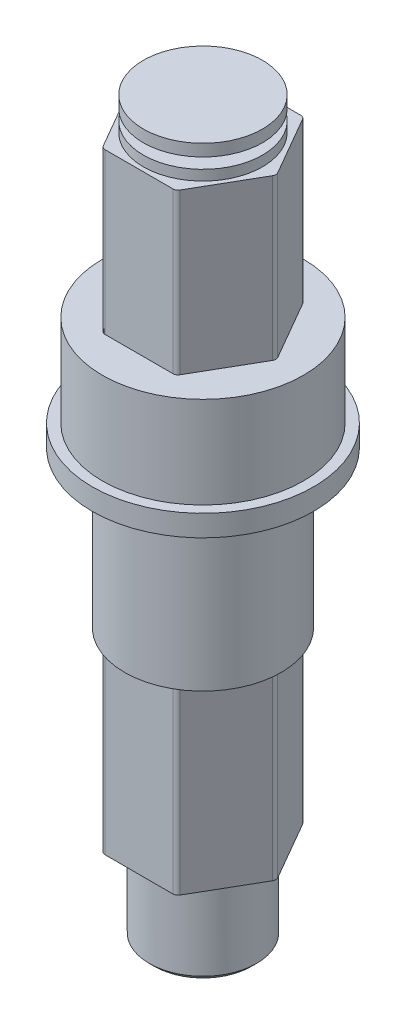
ISO-10303-21;
HEADER;
FILE_DESCRIPTION(('STEP AP214'),'2;1');
FILE_NAME('part.step','',(''),(''),'','','');
FILE_SCHEMA(('AUTOMOTIVE_DESIGN { 1 0 10303 214 1 1 1 1 }'));
ENDSEC;
DATA;
#1=APPLICATION_CONTEXT('core data for automotive mechanical design processes');
#2=APPLICATION_PROTOCOL_DEFINITION('international standard','automotive_design',2000,#1);
#3=PRODUCT_CONTEXT('',#1,'mechanical');
#4=PRODUCT('Part','Part','',(#3));
#5=PRODUCT_RELATED_PRODUCT_CATEGORY('part','',(#4));
#6=PRODUCT_DEFINITION_FORMATION('','',#4);
#7=PRODUCT_DEFINITION_CONTEXT('part definition',#1,'design');
#8=PRODUCT_DEFINITION('design','',#6,#7);
#9=PRODUCT_DEFINITION_SHAPE('','',#8);
#10=(LENGTH_UNIT() NAMED_UNIT(*) SI_UNIT(.MILLI.,.METRE.));
#11=(NAMED_UNIT(*) PLANE_ANGLE_UNIT() SI_UNIT($,.RADIAN.));
#12=(NAMED_UNIT(*) SI_UNIT($,.STERADIAN.) SOLID_ANGLE_UNIT());
#13=UNCERTAINTY_MEASURE_WITH_UNIT(LENGTH_MEASURE(1.E-05),#10,'distance_accuracy_value','');
#14=(GEOMETRIC_REPRESENTATION_CONTEXT(3) GLOBAL_UNCERTAINTY_ASSIGNED_CONTEXT((#13)) GLOBAL_UNIT_ASSIGNED_CONTEXT((#10,
#11,#12)) REPRESENTATION_CONTEXT('',''));
#15=CARTESIAN_POINT('',(0.,0.,0.));
#16=DIRECTION('',(0.,0.,1.));
#17=DIRECTION('',(1.,0.,0.));
#18=AXIS2_PLACEMENT_3D('',#15,#16,#17);
#19=CARTESIAN_POINT('',(2.7496306570156,52.705,4.7625));
#20=DIRECTION('',(-0.866025403784439,0.,-0.5));
#21=DIRECTION('',(-0.5,0.,0.866025403784439));
#22=AXIS2_PLACEMENT_3D('',#19,#20,#21);
#23=PLANE('',#22);
#24=DIRECTION('',(-0.5,0.,0.866025403784439));
#25=VECTOR('',#24,1.);
#26=CARTESIAN_POINT('',(3.1778443335599,40.64,4.02081215572938));
#27=LINE('',#26,#25);
#28=CARTESIAN_POINT('',(5.38927608775056,40.64,0.1905));
#29=VERTEX_POINT('',#28);
#30=CARTESIAN_POINT('',(2.85961588329622,40.64,4.572));
#31=VERTEX_POINT('',#30);
#32=EDGE_CURVE('E263',#29,#31,#27,.T.);
#33=ORIENTED_EDGE('',*,*,#32,.F.);
#34=DIRECTION('',(0.,1.,0.));
#35=VECTOR('',#34,1.);
#36=CARTESIAN_POINT('',(5.38927608775056,52.705,0.1905));
#37=LINE('',#36,#35);
#38=CARTESIAN_POINT('',(5.38927608775056,52.578,0.1905));
#39=VERTEX_POINT('',#38);
#40=EDGE_CURVE('E240',#29,#39,#37,.T.);
#41=ORIENTED_EDGE('',*,*,#40,.T.);
#42=DIRECTION('',(0.5,0.,-0.866025403784439));
#43=VECTOR('',#42,1.);
#44=CARTESIAN_POINT('',(2.7496306570156,52.578,4.7625));
#45=LINE('',#44,#43);
#46=CARTESIAN_POINT('',(2.85961588329622,52.578,4.572));
#47=VERTEX_POINT('',#46);
#48=EDGE_CURVE('E294',#47,#39,#45,.T.);
#49=ORIENTED_EDGE('',*,*,#48,.F.);
#50=DIRECTION('',(0.,1.,0.));
#51=VECTOR('',#50,1.);
#52=CARTESIAN_POINT('',(2.85961588329622,52.705,4.572));
#53=LINE('',#52,#51);
#54=EDGE_CURVE('E238',#47,#31,#53,.F.);
#55=ORIENTED_EDGE('',*,*,#54,.T.);
#56=EDGE_LOOP('',(#33,#41,#49,#55));
#57=FACE_BOUND('',#56,.T.);
#58=ADVANCED_FACE('F19',(#57),#23,.F.);
#59=CARTESIAN_POINT('',(-2.74963065701559,52.705,4.7625));
#60=DIRECTION('',(0.,0.,-1.));
#61=DIRECTION('',(-1.,0.,0.));
#62=AXIS2_PLACEMENT_3D('',#59,#60,#61);
#63=PLANE('',#62);
#64=DIRECTION('',(-1.,0.,0.));
#65=VECTOR('',#64,1.);
#66=CARTESIAN_POINT('',(-1.89320330392697,40.64,4.7625));
#67=LINE('',#66,#65);
#68=CARTESIAN_POINT('',(2.52966020445434,40.64,4.7625));
#69=VERTEX_POINT('',#68);
#70=CARTESIAN_POINT('',(-2.52966020445434,40.64,4.7625));
#71=VERTEX_POINT('',#70);
#72=EDGE_CURVE('E270',#69,#71,#67,.T.);
#73=ORIENTED_EDGE('',*,*,#72,.F.);
#74=DIRECTION('',(0.,1.,0.));
#75=VECTOR('',#74,1.);
#76=CARTESIAN_POINT('',(2.52966020445434,52.705,4.7625));
#77=LINE('',#76,#75);
#78=CARTESIAN_POINT('',(2.52966020445434,52.578,4.7625));
#79=VERTEX_POINT('',#78);
#80=EDGE_CURVE('E244',#69,#79,#77,.T.);
#81=ORIENTED_EDGE('',*,*,#80,.T.);
#82=DIRECTION('',(1.,0.,0.));
#83=VECTOR('',#82,1.);
#84=CARTESIAN_POINT('',(-2.74963065701559,52.578,4.7625));
#85=LINE('',#84,#83);
#86=CARTESIAN_POINT('',(-2.52966020445434,52.578,4.7625));
#87=VERTEX_POINT('',#86);
#88=EDGE_CURVE('E301',#87,#79,#85,.T.);
#89=ORIENTED_EDGE('',*,*,#88,.F.);
#90=DIRECTION('',(0.,1.,0.));
#91=VECTOR('',#90,1.);
#92=CARTESIAN_POINT('',(-2.52966020445434,52.705,4.7625));
#93=LINE('',#92,#91);
#94=EDGE_CURVE('E38',#87,#71,#93,.F.);
#95=ORIENTED_EDGE('',*,*,#94,.T.);
#96=EDGE_LOOP('',(#73,#81,#89,#95));
#97=FACE_BOUND('',#96,.T.);
#98=ADVANCED_FACE('F405',(#97),#63,.F.);
#99=CARTESIAN_POINT('',(-5.49926131403119,52.705,0.));
#100=DIRECTION('',(0.866025403784439,0.,-0.5));
#101=DIRECTION('',(-0.5,0.,-0.866025403784439));
#102=AXIS2_PLACEMENT_3D('',#99,#100,#101);
#103=PLANE('',#102);
#104=DIRECTION('',(0.5,0.,0.866025403784439));
#105=VECTOR('',#104,1.);
#106=CARTESIAN_POINT('',(-5.49926131403119,52.578,0.));
#107=LINE('',#106,#105);
#108=CARTESIAN_POINT('',(-5.38927608775056,52.578,0.1905));
#109=VERTEX_POINT('',#108);
#110=CARTESIAN_POINT('',(-2.85961588329622,52.578,4.572));
#111=VERTEX_POINT('',#110);
#112=EDGE_CURVE('E293',#109,#111,#107,.T.);
#113=ORIENTED_EDGE('',*,*,#112,.F.);
#114=DIRECTION('',(0.,1.,0.));
#115=VECTOR('',#114,1.);
#116=CARTESIAN_POINT('',(-5.38927608775056,52.705,0.1905));
#117=LINE('',#116,#115);
#118=CARTESIAN_POINT('',(-5.38927608775056,40.64,0.1905));
#119=VERTEX_POINT('',#118);
#120=EDGE_CURVE('E235',#109,#119,#117,.F.);
#121=ORIENTED_EDGE('',*,*,#120,.T.);
#122=DIRECTION('',(-0.5,0.,-0.866025403784439));
#123=VECTOR('',#122,1.);
#124=CARTESIAN_POINT('',(-5.07104763748687,40.64,0.74168784427061));
#125=LINE('',#124,#123);
#126=CARTESIAN_POINT('',(-2.85961588329622,40.64,4.572));
#127=VERTEX_POINT('',#126);
#128=EDGE_CURVE('E251',#127,#119,#125,.T.);
#129=ORIENTED_EDGE('',*,*,#128,.F.);
#130=DIRECTION('',(0.,1.,0.));
#131=VECTOR('',#130,1.);
#132=CARTESIAN_POINT('',(-2.85961588329622,52.705,4.572));
#133=LINE('',#132,#131);
#134=EDGE_CURVE('E232',#127,#111,#133,.T.);
#135=ORIENTED_EDGE('',*,*,#134,.T.);
#136=EDGE_LOOP('',(#113,#121,#129,#135));
#137=FACE_BOUND('',#136,.T.);
#138=ADVANCED_FACE('F412',(#137),#103,.F.);
#139=CARTESIAN_POINT('',(-2.74963065701559,52.705,-4.7625));
#140=DIRECTION('',(0.866025403784439,0.,0.5));
#141=DIRECTION('',(0.5,0.,-0.866025403784439));
#142=AXIS2_PLACEMENT_3D('',#139,#140,#141);
#143=PLANE('',#142);
#144=DIRECTION('',(-0.5,0.,0.866025403784439));
#145=VECTOR('',#144,1.);
#146=CARTESIAN_POINT('',(-2.74963065701559,52.578,-4.7625));
#147=LINE('',#146,#145);
#148=CARTESIAN_POINT('',(-2.85961588329622,52.578,-4.572));
#149=VERTEX_POINT('',#148);
#150=CARTESIAN_POINT('',(-5.38927608775056,52.578,-0.1905));
#151=VERTEX_POINT('',#150);
#152=EDGE_CURVE('E256',#149,#151,#147,.T.);
#153=ORIENTED_EDGE('',*,*,#152,.F.);
#154=DIRECTION('',(0.,1.,0.));
#155=VECTOR('',#154,1.);
#156=CARTESIAN_POINT('',(-2.85961588329622,52.705,-4.572));
#157=LINE('',#156,#155);
#158=CARTESIAN_POINT('',(-2.85961588329622,40.64,-4.572));
#159=VERTEX_POINT('',#158);
#160=EDGE_CURVE('E230',#149,#159,#157,.F.);
#161=ORIENTED_EDGE('',*,*,#160,.T.);
#162=DIRECTION('',(0.5,0.,-0.866025403784439));
#163=VECTOR('',#162,1.);
#164=CARTESIAN_POINT('',(-3.1778443335599,40.64,-4.02081215572939));
#165=LINE('',#164,#163);
#166=CARTESIAN_POINT('',(-5.38927608775056,40.64,-0.1905));
#167=VERTEX_POINT('',#166);
#168=EDGE_CURVE('E259',#167,#159,#165,.T.);
#169=ORIENTED_EDGE('',*,*,#168,.F.);
#170=DIRECTION('',(0.,1.,0.));
#171=VECTOR('',#170,1.);
#172=CARTESIAN_POINT('',(-5.38927608775056,52.705,-0.1905));
#173=LINE('',#172,#171);
#174=EDGE_CURVE('E227',#167,#151,#173,.T.);
#175=ORIENTED_EDGE('',*,*,#174,.T.);
#176=EDGE_LOOP('',(#153,#161,#169,#175));
#177=FACE_BOUND('',#176,.T.);
#178=ADVANCED_FACE('F601',(#177),#143,.F.);
#179=CARTESIAN_POINT('',(2.74963065701559,52.705,-4.7625));
#180=DIRECTION('',(0.,0.,1.));
#181=DIRECTION('',(1.,0.,0.));
#182=AXIS2_PLACEMENT_3D('',#179,#180,#181);
#183=PLANE('',#182);
#184=DIRECTION('',(-1.,0.,0.));
#185=VECTOR('',#184,1.);
#186=CARTESIAN_POINT('',(2.74963065701559,52.578,-4.7625));
#187=LINE('',#186,#185);
#188=CARTESIAN_POINT('',(2.52966020445434,52.578,-4.7625));
#189=VERTEX_POINT('',#188);
#190=CARTESIAN_POINT('',(-2.52966020445434,52.578,-4.7625));
#191=VERTEX_POINT('',#190);
#192=EDGE_CURVE('E309',#189,#191,#187,.T.);
#193=ORIENTED_EDGE('',*,*,#192,.F.);
#194=DIRECTION('',(0.,1.,0.));
#195=VECTOR('',#194,1.);
#196=CARTESIAN_POINT('',(2.52966020445434,52.705,-4.7625));
#197=LINE('',#196,#195);
#198=CARTESIAN_POINT('',(2.52966020445434,40.64,-4.7625));
#199=VERTEX_POINT('',#198);
#200=EDGE_CURVE('E224',#189,#199,#197,.F.);
#201=ORIENTED_EDGE('',*,*,#200,.T.);
#202=DIRECTION('',(1.,0.,0.));
#203=VECTOR('',#202,1.);
#204=CARTESIAN_POINT('',(1.89320330392697,40.64,-4.7625));
#205=LINE('',#204,#203);
#206=CARTESIAN_POINT('',(-2.52966020445434,40.64,-4.7625));
#207=VERTEX_POINT('',#206);
#208=EDGE_CURVE('E279',#207,#199,#205,.T.);
#209=ORIENTED_EDGE('',*,*,#208,.F.);
#210=DIRECTION('',(0.,1.,0.));
#211=VECTOR('',#210,1.);
#212=CARTESIAN_POINT('',(-2.52966020445434,52.705,-4.7625));
#213=LINE('',#212,#211);
#214=EDGE_CURVE('E221',#207,#191,#213,.T.);
#215=ORIENTED_EDGE('',*,*,#214,.T.);
#216=EDGE_LOOP('',(#193,#201,#209,#215));
#217=FACE_BOUND('',#216,.T.);
#218=ADVANCED_FACE('F594',(#217),#183,.F.);
#219=CARTESIAN_POINT('',(5.49926131403119,52.705,0.));
#220=DIRECTION('',(-0.866025403784439,0.,0.5));
#221=DIRECTION('',(0.5,0.,0.866025403784439));
#222=AXIS2_PLACEMENT_3D('',#219,#220,#221);
#223=PLANE('',#222);
#224=DIRECTION('',(0.5,0.,0.866025403784439));
#225=VECTOR('',#224,1.);
#226=CARTESIAN_POINT('',(5.07104763748687,40.64,-0.741687844270615));
#227=LINE('',#226,#225);
#228=CARTESIAN_POINT('',(2.85961588329622,40.64,-4.572));
#229=VERTEX_POINT('',#228);
#230=CARTESIAN_POINT('',(5.38927608775056,40.64,-0.1905));
#231=VERTEX_POINT('',#230);
#232=EDGE_CURVE('E262',#229,#231,#227,.T.);
#233=ORIENTED_EDGE('',*,*,#232,.F.);
#234=DIRECTION('',(0.,1.,0.));
#235=VECTOR('',#234,1.);
#236=CARTESIAN_POINT('',(2.85961588329622,52.705,-4.572));
#237=LINE('',#236,#235);
#238=CARTESIAN_POINT('',(2.85961588329622,52.578,-4.572));
#239=VERTEX_POINT('',#238);
#240=EDGE_CURVE('E216',#229,#239,#237,.T.);
#241=ORIENTED_EDGE('',*,*,#240,.T.);
#242=DIRECTION('',(-0.5,0.,-0.866025403784439));
#243=VECTOR('',#242,1.);
#244=CARTESIAN_POINT('',(5.49926131403119,52.578,0.));
#245=LINE('',#244,#243);
#246=CARTESIAN_POINT('',(5.38927608775056,52.578,-0.1905));
#247=VERTEX_POINT('',#246);
#248=EDGE_CURVE('E290',#247,#239,#245,.T.);
#249=ORIENTED_EDGE('',*,*,#248,.F.);
#250=DIRECTION('',(0.,1.,0.));
#251=VECTOR('',#250,1.);
#252=CARTESIAN_POINT('',(5.38927608775056,52.705,-0.1905));
#253=LINE('',#252,#251);
#254=EDGE_CURVE('E214',#247,#231,#253,.F.);
#255=ORIENTED_EDGE('',*,*,#254,.T.);
#256=EDGE_LOOP('',(#233,#241,#249,#255));
#257=FACE_BOUND('',#256,.T.);
#258=ADVANCED_FACE('F430',(#257),#223,.F.);
#259=CARTESIAN_POINT('',(0.,40.64,0.));
#260=DIRECTION('',(0.,1.,0.));
#261=DIRECTION('',(0.,0.,1.));
#262=AXIS2_PLACEMENT_3D('',#259,#260,#261);
#263=PLANE('',#262);
#264=ORIENTED_EDGE('',*,*,#168,.T.);
#265=CARTESIAN_POINT('',(-2.52966020445434,40.64,-4.3815));
#266=DIRECTION('',(0.,1.,0.));
#267=DIRECTION('',(0.,0.,1.));
#268=AXIS2_PLACEMENT_3D('',#265,#266,#267);
#269=CIRCLE('',#268,0.381);
#270=EDGE_CURVE('E268',#159,#207,#269,.F.);
#271=ORIENTED_EDGE('',*,*,#270,.T.);
#272=ORIENTED_EDGE('',*,*,#208,.T.);
#273=CARTESIAN_POINT('',(2.52966020445434,40.64,-4.3815));
#274=DIRECTION('',(0.,1.,0.));
#275=DIRECTION('',(0.,0.,1.));
#276=AXIS2_PLACEMENT_3D('',#273,#274,#275);
#277=CIRCLE('',#276,0.381);
#278=EDGE_CURVE('E247',#199,#229,#277,.F.);
#279=ORIENTED_EDGE('',*,*,#278,.T.);
#280=ORIENTED_EDGE('',*,*,#232,.T.);
#281=CARTESIAN_POINT('',(5.05932040890869,40.64,0.));
#282=DIRECTION('',(0.,1.,0.));
#283=DIRECTION('',(0.,0.,1.));
#284=AXIS2_PLACEMENT_3D('',#281,#282,#283);
#285=CIRCLE('',#284,0.381);
#286=EDGE_CURVE('E267',#231,#29,#285,.F.);
#287=ORIENTED_EDGE('',*,*,#286,.T.);
#288=ORIENTED_EDGE('',*,*,#32,.T.);
#289=CARTESIAN_POINT('',(2.52966020445434,40.64,4.3815));
#290=DIRECTION('',(0.,1.,0.));
#291=DIRECTION('',(0.,0.,1.));
#292=AXIS2_PLACEMENT_3D('',#289,#290,#291);
#293=CIRCLE('',#292,0.381);
#294=EDGE_CURVE('E29',#31,#69,#293,.F.);
#295=ORIENTED_EDGE('',*,*,#294,.T.);
#296=ORIENTED_EDGE('',*,*,#72,.T.);
#297=CARTESIAN_POINT('',(-2.52966020445434,40.64,4.3815));
#298=DIRECTION('',(0.,1.,0.));
#299=DIRECTION('',(0.,0.,1.));
#300=AXIS2_PLACEMENT_3D('',#297,#298,#299);
#301=CIRCLE('',#300,0.381);
#302=EDGE_CURVE('E12',#71,#127,#301,.F.);
#303=ORIENTED_EDGE('',*,*,#302,.T.);
#304=ORIENTED_EDGE('',*,*,#128,.T.);
#305=CARTESIAN_POINT('',(-5.05932040890869,40.64,0.));
#306=DIRECTION('',(0.,1.,0.));
#307=DIRECTION('',(0.,0.,1.));
#308=AXIS2_PLACEMENT_3D('',#305,#306,#307);
#309=CIRCLE('',#308,0.381);
#310=EDGE_CURVE('E264',#119,#167,#309,.F.);
#311=ORIENTED_EDGE('',*,*,#310,.T.);
#312=EDGE_LOOP('',(#264,#271,#272,#279,#280,#287,#288,#295,#296,#303,#304,#311));
#313=FACE_BOUND('',#312,.T.);
#314=CARTESIAN_POINT('',(0.,40.64,0.));
#315=DIRECTION('',(0.,1.,0.));
#316=DIRECTION('',(0.,0.,1.));
#317=AXIS2_PLACEMENT_3D('',#314,#315,#316);
#318=CIRCLE('',#317,7.499999986);
#319=CARTESIAN_POINT('',(0.,40.64,7.499999986));
#320=VERTEX_POINT('',#319);
#321=EDGE_CURVE('E285',#320,#320,#318,.T.);
#322=ORIENTED_EDGE('',*,*,#321,.T.);
#323=EDGE_LOOP('',(#322));
#324=FACE_BOUND('',#323,.T.);
#325=ADVANCED_FACE('F485',(#313,#324),#263,.T.);
#326=CARTESIAN_POINT('',(0.,17.3470920246051,0.));
#327=DIRECTION('',(0.,1.,0.));
#328=DIRECTION('',(0.,0.,1.));
#329=AXIS2_PLACEMENT_3D('',#326,#327,#328);
#330=CYLINDRICAL_SURFACE('',#329,4.445);
#331=CARTESIAN_POINT('',(0.,52.578,0.));
#332=DIRECTION('',(0.,1.,0.));
#333=DIRECTION('',(0.,0.,1.));
#334=AXIS2_PLACEMENT_3D('',#331,#332,#333);
#335=CIRCLE('',#334,4.445);
#336=CARTESIAN_POINT('',(0.,52.578,4.445));
#337=VERTEX_POINT('',#336);
#338=EDGE_CURVE('E305',#337,#337,#335,.F.);
#339=ORIENTED_EDGE('',*,*,#338,.F.);
#340=EDGE_LOOP('',(#339));
#341=FACE_BOUND('',#340,.T.);
#342=CARTESIAN_POINT('',(0.,53.34,0.));
#343=DIRECTION('',(0.,1.,0.));
#344=DIRECTION('',(0.,0.,1.));
#345=AXIS2_PLACEMENT_3D('',#342,#343,#344);
#346=CIRCLE('',#345,4.445);
#347=CARTESIAN_POINT('',(0.,53.34,4.445));
#348=VERTEX_POINT('',#347);
#349=EDGE_CURVE('E320',#348,#348,#346,.T.);
#350=ORIENTED_EDGE('',*,*,#349,.F.);
#351=EDGE_LOOP('',(#350));
#352=FACE_BOUND('',#351,.T.);
#353=ADVANCED_FACE('F483',(#341,#352),#330,.T.);
#354=CARTESIAN_POINT('',(0.,52.578,0.));
#355=DIRECTION('',(0.,1.,0.));
#356=DIRECTION('',(0.,0.,1.));
#357=AXIS2_PLACEMENT_3D('',#354,#355,#356);
#358=PLANE('',#357);
#359=ORIENTED_EDGE('',*,*,#248,.T.);
#360=CARTESIAN_POINT('',(2.52966020445434,52.578,-4.3815));
#361=DIRECTION('',(0.,1.,0.));
#362=DIRECTION('',(0.,0.,1.));
#363=AXIS2_PLACEMENT_3D('',#360,#361,#362);
#364=CIRCLE('',#363,0.381);
#365=EDGE_CURVE('E225',#239,#189,#364,.T.);
#366=ORIENTED_EDGE('',*,*,#365,.T.);
#367=ORIENTED_EDGE('',*,*,#192,.T.);
#368=CARTESIAN_POINT('',(-2.52966020445434,52.578,-4.3815));
#369=DIRECTION('',(0.,1.,0.));
#370=DIRECTION('',(0.,0.,1.));
#371=AXIS2_PLACEMENT_3D('',#368,#369,#370);
#372=CIRCLE('',#371,0.381);
#373=EDGE_CURVE('E311',#191,#149,#372,.T.);
#374=ORIENTED_EDGE('',*,*,#373,.T.);
#375=ORIENTED_EDGE('',*,*,#152,.T.);
#376=CARTESIAN_POINT('',(-5.05932040890869,52.578,0.));
#377=DIRECTION('',(0.,1.,0.));
#378=DIRECTION('',(0.,0.,1.));
#379=AXIS2_PLACEMENT_3D('',#376,#377,#378);
#380=CIRCLE('',#379,0.381);
#381=EDGE_CURVE('E297',#151,#109,#380,.T.);
#382=ORIENTED_EDGE('',*,*,#381,.T.);
#383=ORIENTED_EDGE('',*,*,#112,.T.);
#384=CARTESIAN_POINT('',(-2.52966020445434,52.578,4.3815));
#385=DIRECTION('',(0.,1.,0.));
#386=DIRECTION('',(0.,0.,1.));
#387=AXIS2_PLACEMENT_3D('',#384,#385,#386);
#388=CIRCLE('',#387,0.381);
#389=EDGE_CURVE('E220',#111,#87,#388,.T.);
#390=ORIENTED_EDGE('',*,*,#389,.T.);
#391=ORIENTED_EDGE('',*,*,#88,.T.);
#392=CARTESIAN_POINT('',(2.52966020445434,52.578,4.3815));
#393=DIRECTION('',(0.,1.,0.));
#394=DIRECTION('',(0.,0.,1.));
#395=AXIS2_PLACEMENT_3D('',#392,#393,#394);
#396=CIRCLE('',#395,0.381);
#397=EDGE_CURVE('E298',#79,#47,#396,.T.);
#398=ORIENTED_EDGE('',*,*,#397,.T.);
#399=ORIENTED_EDGE('',*,*,#48,.T.);
#400=CARTESIAN_POINT('',(5.05932040890869,52.578,0.));
#401=DIRECTION('',(0.,1.,0.));
#402=DIRECTION('',(0.,0.,1.));
#403=AXIS2_PLACEMENT_3D('',#400,#401,#402);
#404=CIRCLE('',#403,0.381);
#405=EDGE_CURVE('E295',#39,#247,#404,.T.);
#406=ORIENTED_EDGE('',*,*,#405,.T.);
#407=EDGE_LOOP('',(#359,#366,#367,#374,#375,#382,#383,#390,#391,#398,#399,#406));
#408=FACE_BOUND('',#407,.T.);
#409=ORIENTED_EDGE('',*,*,#338,.T.);
#410=EDGE_LOOP('',(#409));
#411=FACE_BOUND('',#410,.T.);
#412=ADVANCED_FACE('F479',(#408,#411),#358,.T.);
#413=CARTESIAN_POINT('',(0.,55.02275,0.));
#414=DIRECTION('',(0.,1.,0.));
#415=DIRECTION('',(0.,0.,1.));
#416=AXIS2_PLACEMENT_3D('',#413,#414,#415);
#417=PLANE('',#416);
#418=CARTESIAN_POINT('',(0.,55.02275,0.));
#419=DIRECTION('',(0.,1.,0.));
#420=DIRECTION('',(0.,0.,1.));
#421=AXIS2_PLACEMENT_3D('',#418,#419,#420);
#422=CIRCLE('',#421,4.445);
#423=CARTESIAN_POINT('',(0.,55.02275,4.445));
#424=VERTEX_POINT('',#423);
#425=EDGE_CURVE('E252',#424,#424,#422,.T.);
#426=ORIENTED_EDGE('',*,*,#425,.T.);
#427=EDGE_LOOP('',(#426));
#428=FACE_BOUND('',#427,.T.);
#429=ADVANCED_FACE('F482',(#428),#417,.T.);
#430=CARTESIAN_POINT('',(0.,55.53075,0.));
#431=DIRECTION('',(0.,-1.,0.));
#432=DIRECTION('',(0.,0.,-1.));
#433=AXIS2_PLACEMENT_3D('',#430,#431,#432);
#434=CYLINDRICAL_SURFACE('',#433,4.445);
#435=ORIENTED_EDGE('',*,*,#425,.F.);
#436=EDGE_LOOP('',(#435));
#437=FACE_BOUND('',#436,.T.);
#438=CARTESIAN_POINT('',(0.,54.13375,0.));
#439=DIRECTION('',(0.,1.,0.));
#440=DIRECTION('',(0.,0.,1.));
#441=AXIS2_PLACEMENT_3D('',#438,#439,#440);
#442=CIRCLE('',#441,4.445);
#443=CARTESIAN_POINT('',(0.,54.13375,4.445));
#444=VERTEX_POINT('',#443);
#445=EDGE_CURVE('E253',#444,#444,#442,.T.);
#446=ORIENTED_EDGE('',*,*,#445,.T.);
#447=EDGE_LOOP('',(#446));
#448=FACE_BOUND('',#447,.T.);
#449=ADVANCED_FACE('F473',(#437,#448),#434,.T.);
#450=CARTESIAN_POINT('',(0.,54.13375,0.));
#451=DIRECTION('',(0.,1.,0.));
#452=DIRECTION('',(0.,0.,1.));
#453=AXIS2_PLACEMENT_3D('',#450,#451,#452);
#454=PLANE('',#453);
#455=CARTESIAN_POINT('',(0.,54.13375,0.));
#456=DIRECTION('',(0.,1.,0.));
#457=DIRECTION('',(0.,0.,1.));
#458=AXIS2_PLACEMENT_3D('',#455,#456,#457);
#459=CIRCLE('',#458,3.175);
#460=CARTESIAN_POINT('',(0.,54.13375,3.175));
#461=VERTEX_POINT('',#460);
#462=EDGE_CURVE('E248',#461,#461,#459,.T.);
#463=ORIENTED_EDGE('',*,*,#462,.T.);
#464=EDGE_LOOP('',(#463));
#465=FACE_BOUND('',#464,.T.);
#466=ORIENTED_EDGE('',*,*,#445,.F.);
#467=EDGE_LOOP('',(#466));
#468=FACE_BOUND('',#467,.T.);
#469=ADVANCED_FACE('F469',(#465,#468),#454,.F.);
#470=CARTESIAN_POINT('',(0.,54.64175,0.));
#471=DIRECTION('',(0.,-1.,0.));
#472=DIRECTION('',(0.,0.,-1.));
#473=AXIS2_PLACEMENT_3D('',#470,#471,#472);
#474=CYLINDRICAL_SURFACE('',#473,3.175);
#475=ORIENTED_EDGE('',*,*,#462,.F.);
#476=EDGE_LOOP('',(#475));
#477=FACE_BOUND('',#476,.T.);
#478=CARTESIAN_POINT('',(0.,53.34,0.));
#479=DIRECTION('',(0.,1.,0.));
#480=DIRECTION('',(0.,0.,1.));
#481=AXIS2_PLACEMENT_3D('',#478,#479,#480);
#482=CIRCLE('',#481,3.175);
#483=CARTESIAN_POINT('',(0.,53.34,3.175));
#484=VERTEX_POINT('',#483);
#485=EDGE_CURVE('E217',#484,#484,#482,.T.);
#486=ORIENTED_EDGE('',*,*,#485,.T.);
#487=EDGE_LOOP('',(#486));
#488=FACE_BOUND('',#487,.T.);
#489=ADVANCED_FACE('F472',(#477,#488),#474,.T.);
#490=CARTESIAN_POINT('',(0.,53.34,0.));
#491=DIRECTION('',(0.,1.,0.));
#492=DIRECTION('',(0.,0.,1.));
#493=AXIS2_PLACEMENT_3D('',#490,#491,#492);
#494=PLANE('',#493);
#495=ORIENTED_EDGE('',*,*,#485,.F.);
#496=EDGE_LOOP('',(#495));
#497=FACE_BOUND('',#496,.T.);
#498=ORIENTED_EDGE('',*,*,#349,.T.);
#499=EDGE_LOOP('',(#498));
#500=FACE_BOUND('',#499,.T.);
#501=ADVANCED_FACE('F475',(#497,#500),#494,.T.);
#502=CARTESIAN_POINT('',(0.,62.3612033959985,0.));
#503=DIRECTION('',(0.,-1.,0.));
#504=DIRECTION('',(0.,0.,-1.));
#505=AXIS2_PLACEMENT_3D('',#502,#503,#504);
#506=CYLINDRICAL_SURFACE('',#505,7.499999986);
#507=CARTESIAN_POINT('',(0.,33.809760168,0.));
#508=DIRECTION('',(0.,1.,0.));
#509=DIRECTION('',(0.,0.,1.));
#510=AXIS2_PLACEMENT_3D('',#507,#508,#509);
#511=CIRCLE('',#510,7.499999986);
#512=CARTESIAN_POINT('',(0.,33.809760168,7.499999986));
#513=VERTEX_POINT('',#512);
#514=EDGE_CURVE('E331',#513,#513,#511,.T.);
#515=ORIENTED_EDGE('',*,*,#514,.T.);
#516=EDGE_LOOP('',(#515));
#517=FACE_BOUND('',#516,.T.);
#518=ORIENTED_EDGE('',*,*,#321,.F.);
#519=EDGE_LOOP('',(#518));
#520=FACE_BOUND('',#519,.T.);
#521=ADVANCED_FACE('F448',(#517,#520),#506,.T.);
#522=CARTESIAN_POINT('',(2.52966020445434,52.705,-4.3815));
#523=DIRECTION('',(0.,1.,0.));
#524=DIRECTION('',(0.,0.,1.));
#525=AXIS2_PLACEMENT_3D('',#522,#523,#524);
#526=CYLINDRICAL_SURFACE('',#525,0.381);
#527=ORIENTED_EDGE('',*,*,#278,.F.);
#528=ORIENTED_EDGE('',*,*,#200,.F.);
#529=ORIENTED_EDGE('',*,*,#365,.F.);
#530=ORIENTED_EDGE('',*,*,#240,.F.);
#531=EDGE_LOOP('',(#527,#528,#529,#530));
#532=FACE_BOUND('',#531,.T.);
#533=ADVANCED_FACE('F444',(#532),#526,.T.);
#534=CARTESIAN_POINT('',(-2.52966020445434,52.705,-4.3815));
#535=DIRECTION('',(0.,1.,0.));
#536=DIRECTION('',(0.,0.,1.));
#537=AXIS2_PLACEMENT_3D('',#534,#535,#536);
#538=CYLINDRICAL_SURFACE('',#537,0.381);
#539=ORIENTED_EDGE('',*,*,#270,.F.);
#540=ORIENTED_EDGE('',*,*,#160,.F.);
#541=ORIENTED_EDGE('',*,*,#373,.F.);
#542=ORIENTED_EDGE('',*,*,#214,.F.);
#543=EDGE_LOOP('',(#539,#540,#541,#542));
#544=FACE_BOUND('',#543,.T.);
#545=ADVANCED_FACE('F447',(#544),#538,.T.);
#546=CARTESIAN_POINT('',(-5.05932040890869,52.705,0.));
#547=DIRECTION('',(0.,1.,0.));
#548=DIRECTION('',(0.,0.,1.));
#549=AXIS2_PLACEMENT_3D('',#546,#547,#548);
#550=CYLINDRICAL_SURFACE('',#549,0.381);
#551=ORIENTED_EDGE('',*,*,#310,.F.);
#552=ORIENTED_EDGE('',*,*,#120,.F.);
#553=ORIENTED_EDGE('',*,*,#381,.F.);
#554=ORIENTED_EDGE('',*,*,#174,.F.);
#555=EDGE_LOOP('',(#551,#552,#553,#554));
#556=FACE_BOUND('',#555,.T.);
#557=ADVANCED_FACE('F452',(#556),#550,.T.);
#558=CARTESIAN_POINT('',(5.05932040890869,52.705,0.));
#559=DIRECTION('',(0.,1.,0.));
#560=DIRECTION('',(0.,0.,1.));
#561=AXIS2_PLACEMENT_3D('',#558,#559,#560);
#562=CYLINDRICAL_SURFACE('',#561,0.381);
#563=ORIENTED_EDGE('',*,*,#286,.F.);
#564=ORIENTED_EDGE('',*,*,#254,.F.);
#565=ORIENTED_EDGE('',*,*,#405,.F.);
#566=ORIENTED_EDGE('',*,*,#40,.F.);
#567=EDGE_LOOP('',(#563,#564,#565,#566));
#568=FACE_BOUND('',#567,.T.);
#569=ADVANCED_FACE('F456',(#568),#562,.T.);
#570=CARTESIAN_POINT('',(2.52966020445434,52.705,4.3815));
#571=DIRECTION('',(0.,1.,0.));
#572=DIRECTION('',(0.,0.,1.));
#573=AXIS2_PLACEMENT_3D('',#570,#571,#572);
#574=CYLINDRICAL_SURFACE('',#573,0.381);
#575=ORIENTED_EDGE('',*,*,#294,.F.);
#576=ORIENTED_EDGE('',*,*,#54,.F.);
#577=ORIENTED_EDGE('',*,*,#397,.F.);
#578=ORIENTED_EDGE('',*,*,#80,.F.);
#579=EDGE_LOOP('',(#575,#576,#577,#578));
#580=FACE_BOUND('',#579,.T.);
#581=ADVANCED_FACE('F460',(#580),#574,.T.);
#582=CARTESIAN_POINT('',(-2.52966020445434,52.705,4.3815));
#583=DIRECTION('',(0.,1.,0.));
#584=DIRECTION('',(0.,0.,1.));
#585=AXIS2_PLACEMENT_3D('',#582,#583,#584);
#586=CYLINDRICAL_SURFACE('',#585,0.381);
#587=ORIENTED_EDGE('',*,*,#302,.F.);
#588=ORIENTED_EDGE('',*,*,#94,.F.);
#589=ORIENTED_EDGE('',*,*,#389,.F.);
#590=ORIENTED_EDGE('',*,*,#134,.F.);
#591=EDGE_LOOP('',(#587,#588,#589,#590));
#592=FACE_BOUND('',#591,.T.);
#593=ADVANCED_FACE('F464',(#592),#586,.T.);
#594=CARTESIAN_POINT('',(0.,33.809760168,0.));
#595=DIRECTION('',(0.,1.,0.));
#596=DIRECTION('',(0.,0.,1.));
#597=AXIS2_PLACEMENT_3D('',#594,#595,#596);
#598=PLANE('',#597);
#599=CARTESIAN_POINT('',(0.,33.809760168,0.));
#600=DIRECTION('',(0.,1.,0.));
#601=DIRECTION('',(0.,0.,1.));
#602=AXIS2_PLACEMENT_3D('',#599,#600,#601);
#603=CIRCLE('',#602,8.255);
#604=CARTESIAN_POINT('',(0.,33.809760168,8.255));
#605=VERTEX_POINT('',#604);
#606=EDGE_CURVE('E289',#605,#605,#603,.T.);
#607=ORIENTED_EDGE('',*,*,#606,.T.);
#608=EDGE_LOOP('',(#607));
#609=FACE_BOUND('',#608,.T.);
#610=ORIENTED_EDGE('',*,*,#514,.F.);
#611=EDGE_LOOP('',(#610));
#612=FACE_BOUND('',#611,.T.);
#613=ADVANCED_FACE('F400',(#609,#612),#598,.T.);
#614=CARTESIAN_POINT('',(0.,33.809760168,0.));
#615=DIRECTION('',(0.,-1.,0.));
#616=DIRECTION('',(0.,0.,-1.));
#617=AXIS2_PLACEMENT_3D('',#614,#615,#616);
#618=CYLINDRICAL_SURFACE('',#617,8.255);
#619=ORIENTED_EDGE('',*,*,#606,.F.);
#620=EDGE_LOOP('',(#619));
#621=FACE_BOUND('',#620,.T.);
#622=CARTESIAN_POINT('',(0.,32.222260168,0.));
#623=DIRECTION('',(0.,1.,0.));
#624=DIRECTION('',(0.,0.,1.));
#625=AXIS2_PLACEMENT_3D('',#622,#623,#624);
#626=CIRCLE('',#625,8.255);
#627=CARTESIAN_POINT('',(0.,32.222260168,8.255));
#628=VERTEX_POINT('',#627);
#629=EDGE_CURVE('E328',#628,#628,#626,.T.);
#630=ORIENTED_EDGE('',*,*,#629,.T.);
#631=EDGE_LOOP('',(#630));
#632=FACE_BOUND('',#631,.T.);
#633=ADVANCED_FACE('F393',(#621,#632),#618,.T.);
#634=CARTESIAN_POINT('',(0.,0.508,0.));
#635=DIRECTION('',(0.,1.,0.));
#636=DIRECTION('',(0.,0.,1.));
#637=AXIS2_PLACEMENT_3D('',#634,#635,#636);
#638=PLANE('',#637);
#639=CARTESIAN_POINT('',(0.,0.508,0.));
#640=DIRECTION('',(0.,1.,0.));
#641=DIRECTION('',(0.,0.,1.));
#642=AXIS2_PLACEMENT_3D('',#639,#640,#641);
#643=CIRCLE('',#642,3.619);
#644=CARTESIAN_POINT('',(0.,0.508,3.619));
#645=VERTEX_POINT('',#644);
#646=EDGE_CURVE('E371',#645,#645,#643,.F.);
#647=ORIENTED_EDGE('',*,*,#646,.T.);
#648=EDGE_LOOP('',(#647));
#649=FACE_BOUND('',#648,.T.);
#650=ADVANCED_FACE('F388',(#649),#638,.F.);
#651=CARTESIAN_POINT('',(0.,0.508,0.));
#652=DIRECTION('',(0.,1.,0.));
#653=DIRECTION('',(0.,0.,1.));
#654=AXIS2_PLACEMENT_3D('',#651,#652,#653);
#655=CONICAL_SURFACE('',#654,3.619,0.785398163397437);
#656=CARTESIAN_POINT('',(0.,0.889,0.));
#657=DIRECTION('',(0.,1.,0.));
#658=DIRECTION('',(0.,0.,1.));
#659=AXIS2_PLACEMENT_3D('',#656,#657,#658);
#660=CIRCLE('',#659,4.);
#661=CARTESIAN_POINT('',(0.,0.889,4.));
#662=VERTEX_POINT('',#661);
#663=EDGE_CURVE('E173',#662,#662,#660,.T.);
#664=ORIENTED_EDGE('',*,*,#663,.F.);
#665=EDGE_LOOP('',(#664));
#666=FACE_BOUND('',#665,.T.);
#667=ORIENTED_EDGE('',*,*,#646,.F.);
#668=EDGE_LOOP('',(#667));
#669=FACE_BOUND('',#668,.T.);
#670=ADVANCED_FACE('F385',(#666,#669),#655,.T.);
#671=CARTESIAN_POINT('',(0.,7.023749986,0.));
#672=DIRECTION('',(0.,-1.,0.));
#673=DIRECTION('',(0.,0.,-1.));
#674=AXIS2_PLACEMENT_3D('',#671,#672,#673);
#675=CYLINDRICAL_SURFACE('',#674,4.);
#676=ORIENTED_EDGE('',*,*,#663,.T.);
#677=EDGE_LOOP('',(#676));
#678=FACE_BOUND('',#677,.T.);
#679=CARTESIAN_POINT('',(0.,7.023749986,0.));
#680=DIRECTION('',(0.,-1.,0.));
#681=DIRECTION('',(0.,0.,-1.));
#682=AXIS2_PLACEMENT_3D('',#679,#680,#681);
#683=CIRCLE('',#682,4.);
#684=CARTESIAN_POINT('',(0.,7.023749986,-4.));
#685=VERTEX_POINT('',#684);
#686=EDGE_CURVE('E526',#685,#685,#683,.T.);
#687=ORIENTED_EDGE('',*,*,#686,.T.);
#688=EDGE_LOOP('',(#687));
#689=FACE_BOUND('',#688,.T.);
#690=ADVANCED_FACE('F382',(#678,#689),#675,.T.);
#691=CARTESIAN_POINT('',(0.,7.023749986,0.));
#692=DIRECTION('',(0.,-1.,0.));
#693=DIRECTION('',(0.,0.,-1.));
#694=AXIS2_PLACEMENT_3D('',#691,#692,#693);
#695=PLANE('',#694);
#696=ORIENTED_EDGE('',*,*,#686,.F.);
#697=EDGE_LOOP('',(#696));
#698=FACE_BOUND('',#697,.T.);
#699=DIRECTION('',(-0.5,0.,0.866025403784439));
#700=VECTOR('',#699,1.);
#701=CARTESIAN_POINT('',(2.7496306570156,7.023749986,4.7625));
#702=LINE('',#701,#700);
#703=CARTESIAN_POINT('',(5.38927608775056,7.023749986,0.1905));
#704=VERTEX_POINT('',#703);
#705=CARTESIAN_POINT('',(2.85961588329622,7.023749986,4.572));
#706=VERTEX_POINT('',#705);
#707=EDGE_CURVE('E366',#704,#706,#702,.T.);
#708=ORIENTED_EDGE('',*,*,#707,.T.);
#709=CARTESIAN_POINT('',(2.52966020445434,7.023749986,4.3815));
#710=DIRECTION('',(0.,-1.,0.));
#711=DIRECTION('',(0.,0.,-1.));
#712=AXIS2_PLACEMENT_3D('',#709,#710,#711);
#713=CIRCLE('',#712,0.381);
#714=CARTESIAN_POINT('',(2.52966020445434,7.023749986,4.7625));
#715=VERTEX_POINT('',#714);
#716=EDGE_CURVE('E167',#706,#715,#713,.T.);
#717=ORIENTED_EDGE('',*,*,#716,.T.);
#718=DIRECTION('',(-1.,0.,0.));
#719=VECTOR('',#718,1.);
#720=CARTESIAN_POINT('',(-2.74963065701559,7.023749986,4.7625));
#721=LINE('',#720,#719);
#722=CARTESIAN_POINT('',(-2.52966020445434,7.023749986,4.7625));
#723=VERTEX_POINT('',#722);
#724=EDGE_CURVE('E369',#715,#723,#721,.T.);
#725=ORIENTED_EDGE('',*,*,#724,.T.);
#726=CARTESIAN_POINT('',(-2.52966020445434,7.023749986,4.3815));
#727=DIRECTION('',(0.,-1.,0.));
#728=DIRECTION('',(0.,0.,-1.));
#729=AXIS2_PLACEMENT_3D('',#726,#727,#728);
#730=CIRCLE('',#729,0.381);
#731=CARTESIAN_POINT('',(-2.85961588329622,7.023749986,4.572));
#732=VERTEX_POINT('',#731);
#733=EDGE_CURVE('E185',#723,#732,#730,.T.);
#734=ORIENTED_EDGE('',*,*,#733,.T.);
#735=DIRECTION('',(-0.5,0.,-0.866025403784439));
#736=VECTOR('',#735,1.);
#737=CARTESIAN_POINT('',(-5.49926131403119,7.023749986,0.));
#738=LINE('',#737,#736);
#739=CARTESIAN_POINT('',(-5.38927608775056,7.023749986,0.1905));
#740=VERTEX_POINT('',#739);
#741=EDGE_CURVE('E374',#732,#740,#738,.T.);
#742=ORIENTED_EDGE('',*,*,#741,.T.);
#743=CARTESIAN_POINT('',(-5.05932040890869,7.023749986,0.));
#744=DIRECTION('',(0.,-1.,0.));
#745=DIRECTION('',(0.,0.,-1.));
#746=AXIS2_PLACEMENT_3D('',#743,#744,#745);
#747=CIRCLE('',#746,0.381);
#748=CARTESIAN_POINT('',(-5.38927608775056,7.023749986,-0.1905));
#749=VERTEX_POINT('',#748);
#750=EDGE_CURVE('E182',#740,#749,#747,.T.);
#751=ORIENTED_EDGE('',*,*,#750,.T.);
#752=DIRECTION('',(0.5,0.,-0.866025403784439));
#753=VECTOR('',#752,1.);
#754=CARTESIAN_POINT('',(-2.74963065701559,7.023749986,-4.7625));
#755=LINE('',#754,#753);
#756=CARTESIAN_POINT('',(-2.85961588329622,7.023749986,-4.572));
#757=VERTEX_POINT('',#756);
#758=EDGE_CURVE('E530',#749,#757,#755,.T.);
#759=ORIENTED_EDGE('',*,*,#758,.T.);
#760=CARTESIAN_POINT('',(-2.52966020445434,7.023749986,-4.3815));
#761=DIRECTION('',(0.,-1.,0.));
#762=DIRECTION('',(0.,0.,-1.));
#763=AXIS2_PLACEMENT_3D('',#760,#761,#762);
#764=CIRCLE('',#763,0.381);
#765=CARTESIAN_POINT('',(-2.52966020445434,7.023749986,-4.7625));
#766=VERTEX_POINT('',#765);
#767=EDGE_CURVE('E168',#757,#766,#764,.T.);
#768=ORIENTED_EDGE('',*,*,#767,.T.);
#769=DIRECTION('',(1.,0.,0.));
#770=VECTOR('',#769,1.);
#771=CARTESIAN_POINT('',(2.74963065701559,7.023749986,-4.7625));
#772=LINE('',#771,#770);
#773=CARTESIAN_POINT('',(2.52966020445434,7.023749986,-4.7625));
#774=VERTEX_POINT('',#773);
#775=EDGE_CURVE('E527',#766,#774,#772,.T.);
#776=ORIENTED_EDGE('',*,*,#775,.T.);
#777=CARTESIAN_POINT('',(2.52966020445434,7.023749986,-4.3815));
#778=DIRECTION('',(0.,-1.,0.));
#779=DIRECTION('',(0.,0.,-1.));
#780=AXIS2_PLACEMENT_3D('',#777,#778,#779);
#781=CIRCLE('',#780,0.381);
#782=CARTESIAN_POINT('',(2.85961588329622,7.023749986,-4.572));
#783=VERTEX_POINT('',#782);
#784=EDGE_CURVE('E171',#774,#783,#781,.T.);
#785=ORIENTED_EDGE('',*,*,#784,.T.);
#786=DIRECTION('',(0.5,0.,0.866025403784439));
#787=VECTOR('',#786,1.);
#788=CARTESIAN_POINT('',(5.49926131403119,7.023749986,0.));
#789=LINE('',#788,#787);
#790=CARTESIAN_POINT('',(5.38927608775056,7.023749986,-0.1905));
#791=VERTEX_POINT('',#790);
#792=EDGE_CURVE('E367',#783,#791,#789,.T.);
#793=ORIENTED_EDGE('',*,*,#792,.T.);
#794=CARTESIAN_POINT('',(5.05932040890869,7.023749986,0.));
#795=DIRECTION('',(0.,-1.,0.));
#796=DIRECTION('',(0.,0.,-1.));
#797=AXIS2_PLACEMENT_3D('',#794,#795,#796);
#798=CIRCLE('',#797,0.381);
#799=EDGE_CURVE('E179',#791,#704,#798,.T.);
#800=ORIENTED_EDGE('',*,*,#799,.T.);
#801=EDGE_LOOP('',(#708,#717,#725,#734,#742,#751,#759,#768,#776,#785,#793,#800));
#802=FACE_BOUND('',#801,.T.);
#803=ADVANCED_FACE('F365',(#698,#802),#695,.T.);
#804=CARTESIAN_POINT('',(-2.52966020445434,52.705,4.3815));
#805=DIRECTION('',(0.,-1.,0.));
#806=DIRECTION('',(0.,0.,-1.));
#807=AXIS2_PLACEMENT_3D('',#804,#805,#806);
#808=CYLINDRICAL_SURFACE('',#807,0.381);
#809=CARTESIAN_POINT('',(-2.52966020445434,20.612749986,4.3815));
#810=DIRECTION('',(0.,1.,0.));
#811=DIRECTION('',(0.,0.,1.));
#812=AXIS2_PLACEMENT_3D('',#809,#810,#811);
#813=CIRCLE('',#812,0.381);
#814=CARTESIAN_POINT('',(-2.85961588329622,20.612749986,4.572));
#815=VERTEX_POINT('',#814);
#816=CARTESIAN_POINT('',(-2.52966020445434,20.612749986,4.7625));
#817=VERTEX_POINT('',#816);
#818=EDGE_CURVE('E152',#815,#817,#813,.T.);
#819=ORIENTED_EDGE('',*,*,#818,.F.);
#820=DIRECTION('',(0.,-1.,0.));
#821=VECTOR('',#820,1.);
#822=CARTESIAN_POINT('',(-2.85961588329622,52.705,4.572));
#823=LINE('',#822,#821);
#824=EDGE_CURVE('E198',#732,#815,#823,.F.);
#825=ORIENTED_EDGE('',*,*,#824,.F.);
#826=ORIENTED_EDGE('',*,*,#733,.F.);
#827=DIRECTION('',(0.,-1.,0.));
#828=VECTOR('',#827,1.);
#829=CARTESIAN_POINT('',(-2.52966020445434,52.705,4.7625));
#830=LINE('',#829,#828);
#831=EDGE_CURVE('E189',#817,#723,#830,.T.);
#832=ORIENTED_EDGE('',*,*,#831,.F.);
#833=EDGE_LOOP('',(#819,#825,#826,#832));
#834=FACE_BOUND('',#833,.T.);
#835=ADVANCED_FACE('F516',(#834),#808,.T.);
#836=ORIENTED_EDGE('',*,*,#741,.F.);
#837=ORIENTED_EDGE('',*,*,#824,.T.);
#838=DIRECTION('',(0.5,0.,0.866025403784439));
#839=VECTOR('',#838,1.);
#840=CARTESIAN_POINT('',(-5.49926131403119,20.612749986,0.));
#841=LINE('',#840,#839);
#842=CARTESIAN_POINT('',(-5.38927608775056,20.612749986,0.1905));
#843=VERTEX_POINT('',#842);
#844=EDGE_CURVE('E333',#843,#815,#841,.T.);
#845=ORIENTED_EDGE('',*,*,#844,.F.);
#846=DIRECTION('',(0.,-1.,0.));
#847=VECTOR('',#846,1.);
#848=CARTESIAN_POINT('',(-5.38927608775056,52.705,0.1905));
#849=LINE('',#848,#847);
#850=EDGE_CURVE('E195',#843,#740,#849,.T.);
#851=ORIENTED_EDGE('',*,*,#850,.T.);
#852=EDGE_LOOP('',(#836,#837,#845,#851));
#853=FACE_BOUND('',#852,.T.);
#854=ADVANCED_FACE('F522',(#853),#103,.F.);
#855=CARTESIAN_POINT('',(-5.05932040890869,52.705,0.));
#856=DIRECTION('',(0.,-1.,0.));
#857=DIRECTION('',(0.,0.,-1.));
#858=AXIS2_PLACEMENT_3D('',#855,#856,#857);
#859=CYLINDRICAL_SURFACE('',#858,0.381);
#860=CARTESIAN_POINT('',(-5.05932040890869,20.612749986,0.));
#861=DIRECTION('',(0.,1.,0.));
#862=DIRECTION('',(0.,0.,1.));
#863=AXIS2_PLACEMENT_3D('',#860,#861,#862);
#864=CIRCLE('',#863,0.381);
#865=CARTESIAN_POINT('',(-5.38927608775056,20.612749986,-0.1905));
#866=VERTEX_POINT('',#865);
#867=EDGE_CURVE('E335',#866,#843,#864,.T.);
#868=ORIENTED_EDGE('',*,*,#867,.F.);
#869=DIRECTION('',(0.,-1.,0.));
#870=VECTOR('',#869,1.);
#871=CARTESIAN_POINT('',(-5.38927608775056,52.705,-0.1905));
#872=LINE('',#871,#870);
#873=EDGE_CURVE('E203',#749,#866,#872,.F.);
#874=ORIENTED_EDGE('',*,*,#873,.F.);
#875=ORIENTED_EDGE('',*,*,#750,.F.);
#876=ORIENTED_EDGE('',*,*,#850,.F.);
#877=EDGE_LOOP('',(#868,#874,#875,#876));
#878=FACE_BOUND('',#877,.T.);
#879=ADVANCED_FACE('F433',(#878),#859,.T.);
#880=ORIENTED_EDGE('',*,*,#758,.F.);
#881=ORIENTED_EDGE('',*,*,#873,.T.);
#882=DIRECTION('',(-0.5,0.,0.866025403784439));
#883=VECTOR('',#882,1.);
#884=CARTESIAN_POINT('',(-2.7496306570156,20.612749986,-4.7625));
#885=LINE('',#884,#883);
#886=CARTESIAN_POINT('',(-2.85961588329622,20.612749986,-4.572));
#887=VERTEX_POINT('',#886);
#888=EDGE_CURVE('E338',#887,#866,#885,.T.);
#889=ORIENTED_EDGE('',*,*,#888,.F.);
#890=DIRECTION('',(0.,-1.,0.));
#891=VECTOR('',#890,1.);
#892=CARTESIAN_POINT('',(-2.85961588329622,52.705,-4.572));
#893=LINE('',#892,#891);
#894=EDGE_CURVE('E200',#887,#757,#893,.T.);
#895=ORIENTED_EDGE('',*,*,#894,.T.);
#896=EDGE_LOOP('',(#880,#881,#889,#895));
#897=FACE_BOUND('',#896,.T.);
#898=ADVANCED_FACE('F442',(#897),#143,.F.);
#899=CARTESIAN_POINT('',(-2.52966020445434,52.705,-4.3815));
#900=DIRECTION('',(0.,-1.,0.));
#901=DIRECTION('',(0.,0.,-1.));
#902=AXIS2_PLACEMENT_3D('',#899,#900,#901);
#903=CYLINDRICAL_SURFACE('',#902,0.381);
#904=CARTESIAN_POINT('',(-2.52966020445434,20.612749986,-4.3815));
#905=DIRECTION('',(0.,1.,0.));
#906=DIRECTION('',(0.,0.,1.));
#907=AXIS2_PLACEMENT_3D('',#904,#905,#906);
#908=CIRCLE('',#907,0.381);
#909=CARTESIAN_POINT('',(-2.52966020445434,20.612749986,-4.7625));
#910=VERTEX_POINT('',#909);
#911=EDGE_CURVE('E323',#910,#887,#908,.T.);
#912=ORIENTED_EDGE('',*,*,#911,.F.);
#913=DIRECTION('',(0.,-1.,0.));
#914=VECTOR('',#913,1.);
#915=CARTESIAN_POINT('',(-2.52966020445434,52.705,-4.7625));
#916=LINE('',#915,#914);
#917=EDGE_CURVE('E210',#766,#910,#916,.F.);
#918=ORIENTED_EDGE('',*,*,#917,.F.);
#919=ORIENTED_EDGE('',*,*,#767,.F.);
#920=ORIENTED_EDGE('',*,*,#894,.F.);
#921=EDGE_LOOP('',(#912,#918,#919,#920));
#922=FACE_BOUND('',#921,.T.);
#923=ADVANCED_FACE('F439',(#922),#903,.T.);
#924=DIRECTION('',(-1.,0.,0.));
#925=VECTOR('',#924,1.);
#926=CARTESIAN_POINT('',(2.74963065701559,20.612749986,-4.7625));
#927=LINE('',#926,#925);
#928=CARTESIAN_POINT('',(2.52966020445434,20.612749986,-4.7625));
#929=VERTEX_POINT('',#928);
#930=EDGE_CURVE('E343',#929,#910,#927,.T.);
#931=ORIENTED_EDGE('',*,*,#930,.F.);
#932=DIRECTION('',(0.,-1.,0.));
#933=VECTOR('',#932,1.);
#934=CARTESIAN_POINT('',(2.52966020445434,52.705,-4.7625));
#935=LINE('',#934,#933);
#936=EDGE_CURVE('E153',#929,#774,#935,.T.);
#937=ORIENTED_EDGE('',*,*,#936,.T.);
#938=ORIENTED_EDGE('',*,*,#775,.F.);
#939=ORIENTED_EDGE('',*,*,#917,.T.);
#940=EDGE_LOOP('',(#931,#937,#938,#939));
#941=FACE_BOUND('',#940,.T.);
#942=ADVANCED_FACE('F437',(#941),#183,.F.);
#943=CARTESIAN_POINT('',(2.52966020445434,52.705,-4.3815));
#944=DIRECTION('',(0.,-1.,0.));
#945=DIRECTION('',(0.,0.,-1.));
#946=AXIS2_PLACEMENT_3D('',#943,#944,#945);
#947=CYLINDRICAL_SURFACE('',#946,0.381);
#948=CARTESIAN_POINT('',(2.52966020445434,20.612749986,-4.3815));
#949=DIRECTION('',(0.,1.,0.));
#950=DIRECTION('',(0.,0.,1.));
#951=AXIS2_PLACEMENT_3D('',#948,#949,#950);
#952=CIRCLE('',#951,0.381);
#953=CARTESIAN_POINT('',(2.85961588329622,20.612749986,-4.572));
#954=VERTEX_POINT('',#953);
#955=EDGE_CURVE('E345',#954,#929,#952,.T.);
#956=ORIENTED_EDGE('',*,*,#955,.F.);
#957=DIRECTION('',(0.,-1.,0.));
#958=VECTOR('',#957,1.);
#959=CARTESIAN_POINT('',(2.85961588329622,52.705,-4.572));
#960=LINE('',#959,#958);
#961=EDGE_CURVE('E205',#783,#954,#960,.F.);
#962=ORIENTED_EDGE('',*,*,#961,.F.);
#963=ORIENTED_EDGE('',*,*,#784,.F.);
#964=ORIENTED_EDGE('',*,*,#936,.F.);
#965=EDGE_LOOP('',(#956,#962,#963,#964));
#966=FACE_BOUND('',#965,.T.);
#967=ADVANCED_FACE('F429',(#966),#947,.T.);
#968=DIRECTION('',(-0.5,0.,-0.866025403784439));
#969=VECTOR('',#968,1.);
#970=CARTESIAN_POINT('',(5.49926131403119,20.612749986,0.));
#971=LINE('',#970,#969);
#972=CARTESIAN_POINT('',(5.38927608775056,20.612749986,-0.1905));
#973=VERTEX_POINT('',#972);
#974=EDGE_CURVE('E283',#973,#954,#971,.T.);
#975=ORIENTED_EDGE('',*,*,#974,.F.);
#976=DIRECTION('',(0.,-1.,0.));
#977=VECTOR('',#976,1.);
#978=CARTESIAN_POINT('',(5.38927608775056,52.705,-0.1905));
#979=LINE('',#978,#977);
#980=EDGE_CURVE('E207',#973,#791,#979,.T.);
#981=ORIENTED_EDGE('',*,*,#980,.T.);
#982=ORIENTED_EDGE('',*,*,#792,.F.);
#983=ORIENTED_EDGE('',*,*,#961,.T.);
#984=EDGE_LOOP('',(#975,#981,#982,#983));
#985=FACE_BOUND('',#984,.T.);
#986=ADVANCED_FACE('F356',(#985),#223,.F.);
#987=CARTESIAN_POINT('',(5.05932040890869,52.705,0.));
#988=DIRECTION('',(0.,-1.,0.));
#989=DIRECTION('',(0.,0.,-1.));
#990=AXIS2_PLACEMENT_3D('',#987,#988,#989);
#991=CYLINDRICAL_SURFACE('',#990,0.381);
#992=CARTESIAN_POINT('',(5.05932040890869,20.612749986,0.));
#993=DIRECTION('',(0.,1.,0.));
#994=DIRECTION('',(0.,0.,1.));
#995=AXIS2_PLACEMENT_3D('',#992,#993,#994);
#996=CIRCLE('',#995,0.381);
#997=CARTESIAN_POINT('',(5.38927608775056,20.612749986,0.1905));
#998=VERTEX_POINT('',#997);
#999=EDGE_CURVE('E340',#998,#973,#996,.T.);
#1000=ORIENTED_EDGE('',*,*,#999,.F.);
#1001=DIRECTION('',(0.,-1.,0.));
#1002=VECTOR('',#1001,1.);
#1003=CARTESIAN_POINT('',(5.38927608775056,52.705,0.1905));
#1004=LINE('',#1003,#1002);
#1005=EDGE_CURVE('E162',#704,#998,#1004,.F.);
#1006=ORIENTED_EDGE('',*,*,#1005,.F.);
#1007=ORIENTED_EDGE('',*,*,#799,.F.);
#1008=ORIENTED_EDGE('',*,*,#980,.F.);
#1009=EDGE_LOOP('',(#1000,#1006,#1007,#1008));
#1010=FACE_BOUND('',#1009,.T.);
#1011=ADVANCED_FACE('F361',(#1010),#991,.T.);
#1012=DIRECTION('',(0.5,0.,-0.866025403784439));
#1013=VECTOR('',#1012,1.);
#1014=CARTESIAN_POINT('',(2.7496306570156,20.612749986,4.7625));
#1015=LINE('',#1014,#1013);
#1016=CARTESIAN_POINT('',(2.85961588329622,20.612749986,4.572));
#1017=VERTEX_POINT('',#1016);
#1018=EDGE_CURVE('E145',#1017,#998,#1015,.T.);
#1019=ORIENTED_EDGE('',*,*,#1018,.F.);
#1020=DIRECTION('',(0.,-1.,0.));
#1021=VECTOR('',#1020,1.);
#1022=CARTESIAN_POINT('',(2.85961588329622,52.705,4.572));
#1023=LINE('',#1022,#1021);
#1024=EDGE_CURVE('E159',#1017,#706,#1023,.T.);
#1025=ORIENTED_EDGE('',*,*,#1024,.T.);
#1026=ORIENTED_EDGE('',*,*,#707,.F.);
#1027=ORIENTED_EDGE('',*,*,#1005,.T.);
#1028=EDGE_LOOP('',(#1019,#1025,#1026,#1027));
#1029=FACE_BOUND('',#1028,.T.);
#1030=ADVANCED_FACE('F156',(#1029),#23,.F.);
#1031=CARTESIAN_POINT('',(2.52966020445434,52.705,4.3815));
#1032=DIRECTION('',(0.,-1.,0.));
#1033=DIRECTION('',(0.,0.,-1.));
#1034=AXIS2_PLACEMENT_3D('',#1031,#1032,#1033);
#1035=CYLINDRICAL_SURFACE('',#1034,0.381);
#1036=CARTESIAN_POINT('',(2.52966020445434,20.612749986,4.3815));
#1037=DIRECTION('',(0.,1.,0.));
#1038=DIRECTION('',(0.,0.,1.));
#1039=AXIS2_PLACEMENT_3D('',#1036,#1037,#1038);
#1040=CIRCLE('',#1039,0.381);
#1041=CARTESIAN_POINT('',(2.52966020445434,20.612749986,4.7625));
#1042=VERTEX_POINT('',#1041);
#1043=EDGE_CURVE('E142',#1042,#1017,#1040,.T.);
#1044=ORIENTED_EDGE('',*,*,#1043,.F.);
#1045=DIRECTION('',(0.,-1.,0.));
#1046=VECTOR('',#1045,1.);
#1047=CARTESIAN_POINT('',(2.52966020445434,52.705,4.7625));
#1048=LINE('',#1047,#1046);
#1049=EDGE_CURVE('E192',#715,#1042,#1048,.F.);
#1050=ORIENTED_EDGE('',*,*,#1049,.F.);
#1051=ORIENTED_EDGE('',*,*,#716,.F.);
#1052=ORIENTED_EDGE('',*,*,#1024,.F.);
#1053=EDGE_LOOP('',(#1044,#1050,#1051,#1052));
#1054=FACE_BOUND('',#1053,.T.);
#1055=ADVANCED_FACE('F165',(#1054),#1035,.T.);
#1056=ORIENTED_EDGE('',*,*,#724,.F.);
#1057=ORIENTED_EDGE('',*,*,#1049,.T.);
#1058=DIRECTION('',(1.,0.,0.));
#1059=VECTOR('',#1058,1.);
#1060=CARTESIAN_POINT('',(-2.74963065701559,20.612749986,4.7625));
#1061=LINE('',#1060,#1059);
#1062=EDGE_CURVE('E148',#817,#1042,#1061,.T.);
#1063=ORIENTED_EDGE('',*,*,#1062,.F.);
#1064=ORIENTED_EDGE('',*,*,#831,.T.);
#1065=EDGE_LOOP('',(#1056,#1057,#1063,#1064));
#1066=FACE_BOUND('',#1065,.T.);
#1067=ADVANCED_FACE('F414',(#1066),#63,.F.);
#1068=CARTESIAN_POINT('',(0.,20.612749986,0.));
#1069=DIRECTION('',(0.,1.,0.));
#1070=DIRECTION('',(0.,0.,1.));
#1071=AXIS2_PLACEMENT_3D('',#1068,#1069,#1070);
#1072=PLANE('',#1071);
#1073=ORIENTED_EDGE('',*,*,#1062,.T.);
#1074=ORIENTED_EDGE('',*,*,#1043,.T.);
#1075=ORIENTED_EDGE('',*,*,#1018,.T.);
#1076=ORIENTED_EDGE('',*,*,#999,.T.);
#1077=ORIENTED_EDGE('',*,*,#974,.T.);
#1078=ORIENTED_EDGE('',*,*,#955,.T.);
#1079=ORIENTED_EDGE('',*,*,#930,.T.);
#1080=ORIENTED_EDGE('',*,*,#911,.T.);
#1081=ORIENTED_EDGE('',*,*,#888,.T.);
#1082=ORIENTED_EDGE('',*,*,#867,.T.);
#1083=ORIENTED_EDGE('',*,*,#844,.T.);
#1084=ORIENTED_EDGE('',*,*,#818,.T.);
#1085=EDGE_LOOP('',(#1073,#1074,#1075,#1076,#1077,#1078,#1079,#1080,#1081,#1082,#1083,#1084));
#1086=FACE_BOUND('',#1085,.T.);
#1087=CARTESIAN_POINT('',(0.,20.612749986,0.));
#1088=DIRECTION('',(0.,1.,0.));
#1089=DIRECTION('',(0.,0.,1.));
#1090=AXIS2_PLACEMENT_3D('',#1087,#1088,#1089);
#1091=CIRCLE('',#1090,5.842);
#1092=CARTESIAN_POINT('',(0.,20.612749986,5.842));
#1093=VERTEX_POINT('',#1092);
#1094=EDGE_CURVE('E23',#1093,#1093,#1091,.T.);
#1095=ORIENTED_EDGE('',*,*,#1094,.F.);
#1096=EDGE_LOOP('',(#1095));
#1097=FACE_BOUND('',#1096,.T.);
#1098=ADVANCED_FACE('F21',(#1086,#1097),#1072,.F.);
#1099=CARTESIAN_POINT('',(0.,20.485749986,0.));
#1100=DIRECTION('',(0.,1.,0.));
#1101=DIRECTION('',(0.,0.,1.));
#1102=AXIS2_PLACEMENT_3D('',#1099,#1100,#1101);
#1103=CYLINDRICAL_SURFACE('',#1102,5.842);
#1104=ORIENTED_EDGE('',*,*,#1094,.T.);
#1105=EDGE_LOOP('',(#1104));
#1106=FACE_BOUND('',#1105,.T.);
#1107=CARTESIAN_POINT('',(0.,32.222260168,0.));
#1108=DIRECTION('',(0.,1.,0.));
#1109=DIRECTION('',(0.,0.,1.));
#1110=AXIS2_PLACEMENT_3D('',#1107,#1108,#1109);
#1111=CIRCLE('',#1110,5.842);
#1112=CARTESIAN_POINT('',(0.,32.222260168,5.842));
#1113=VERTEX_POINT('',#1112);
#1114=EDGE_CURVE('E288',#1113,#1113,#1111,.F.);
#1115=ORIENTED_EDGE('',*,*,#1114,.T.);
#1116=EDGE_LOOP('',(#1115));
#1117=FACE_BOUND('',#1116,.T.);
#1118=ADVANCED_FACE('F493',(#1106,#1117),#1103,.T.);
#1119=CARTESIAN_POINT('',(0.,32.222260168,0.));
#1120=DIRECTION('',(0.,1.,0.));
#1121=DIRECTION('',(0.,0.,1.));
#1122=AXIS2_PLACEMENT_3D('',#1119,#1120,#1121);
#1123=PLANE('',#1122);
#1124=ORIENTED_EDGE('',*,*,#1114,.F.);
#1125=EDGE_LOOP('',(#1124));
#1126=FACE_BOUND('',#1125,.T.);
#1127=ORIENTED_EDGE('',*,*,#629,.F.);
#1128=EDGE_LOOP('',(#1127));
#1129=FACE_BOUND('',#1128,.T.);
#1130=ADVANCED_FACE('F491',(#1126,#1129),#1123,.F.);
#1131=CLOSED_SHELL('',(#58,#98,#138,#178,#218,#258,#325,#353,#412,#429,#449,#469,#489,#501,#521,
#533,#545,#557,#569,#581,#593,#613,#633,#650,#670,#690,#803,#835,#854,#879,#898,#923,#942,#967,
#986,#1011,#1030,#1055,#1067,#1098,#1118,#1130));
#1132=MANIFOLD_SOLID_BREP('B1',#1131);
#1133=ADVANCED_BREP_SHAPE_REPRESENTATION('',(#18,#1132),#14);
#1134=SHAPE_DEFINITION_REPRESENTATION(#9,#1133);
ENDSEC;
END-ISO-10303-21;
